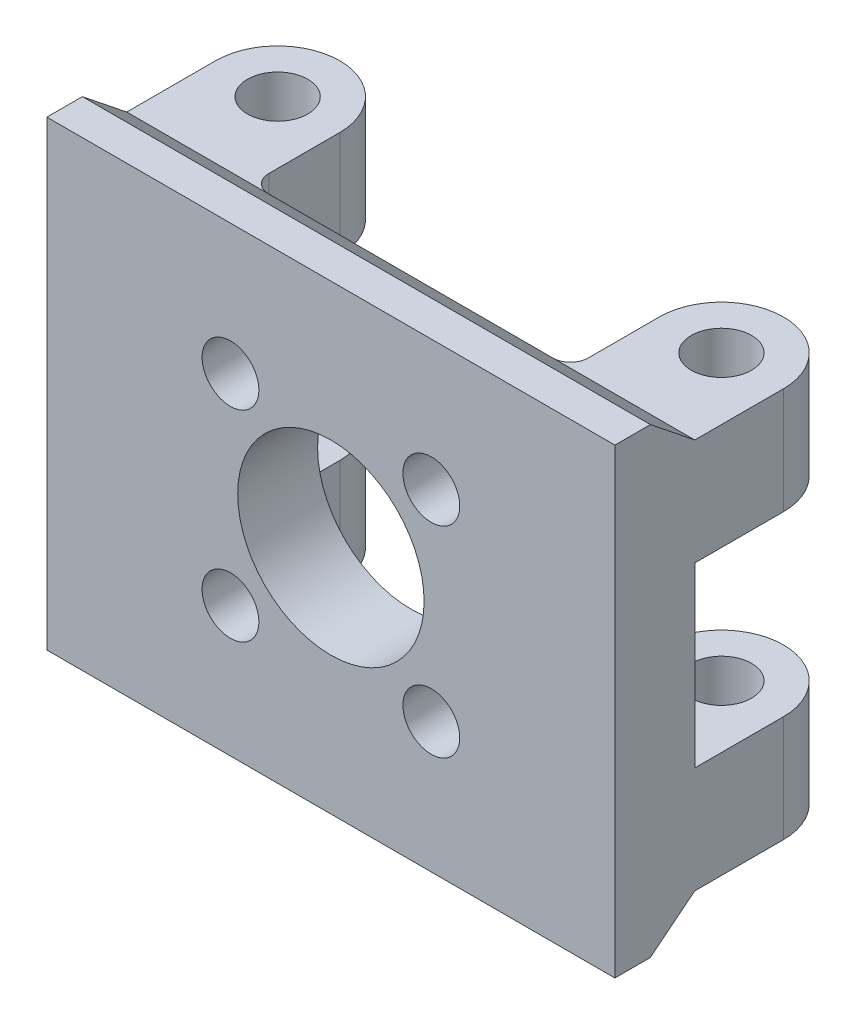
ISO-10303-21;
HEADER;
FILE_DESCRIPTION(('STEP AP214'),'2;1');
FILE_NAME('part.step','',(''),(''),'','','');
FILE_SCHEMA(('AUTOMOTIVE_DESIGN { 1 0 10303 214 1 1 1 1 }'));
ENDSEC;
DATA;
#1=APPLICATION_CONTEXT('core data for automotive mechanical design processes');
#2=APPLICATION_PROTOCOL_DEFINITION('international standard','automotive_design',2000,#1);
#3=PRODUCT_CONTEXT('',#1,'mechanical');
#4=PRODUCT('Part','Part','',(#3));
#5=PRODUCT_RELATED_PRODUCT_CATEGORY('part','',(#4));
#6=PRODUCT_DEFINITION_FORMATION('','',#4);
#7=PRODUCT_DEFINITION_CONTEXT('part definition',#1,'design');
#8=PRODUCT_DEFINITION('design','',#6,#7);
#9=PRODUCT_DEFINITION_SHAPE('','',#8);
#10=(LENGTH_UNIT() NAMED_UNIT(*) SI_UNIT(.MILLI.,.METRE.));
#11=(NAMED_UNIT(*) PLANE_ANGLE_UNIT() SI_UNIT($,.RADIAN.));
#12=(NAMED_UNIT(*) SI_UNIT($,.STERADIAN.) SOLID_ANGLE_UNIT());
#13=UNCERTAINTY_MEASURE_WITH_UNIT(LENGTH_MEASURE(1.E-05),#10,'distance_accuracy_value','');
#14=(GEOMETRIC_REPRESENTATION_CONTEXT(3) GLOBAL_UNCERTAINTY_ASSIGNED_CONTEXT((#13)) GLOBAL_UNIT_ASSIGNED_CONTEXT((#10,
#11,#12)) REPRESENTATION_CONTEXT('',''));
#15=CARTESIAN_POINT('',(0.,0.,0.));
#16=DIRECTION('',(0.,0.,1.));
#17=DIRECTION('',(1.,0.,0.));
#18=AXIS2_PLACEMENT_3D('',#15,#16,#17);
#19=CARTESIAN_POINT('',(-16.,11.,2.5));
#20=DIRECTION('',(0.,1.,0.));
#21=DIRECTION('',(-1.,0.,0.));
#22=AXIS2_PLACEMENT_3D('',#19,#20,#21);
#23=PLANE('',#22);
#24=DIRECTION('',(1.,0.,0.));
#25=VECTOR('',#24,1.);
#26=CARTESIAN_POINT('',(-16.,11.,0.));
#27=LINE('',#26,#25);
#28=CARTESIAN_POINT('',(16.,11.,0.));
#29=VERTEX_POINT('',#28);
#30=CARTESIAN_POINT('',(8.00000000000001,11.,0.));
#31=VERTEX_POINT('',#30);
#32=EDGE_CURVE('E208',#29,#31,#27,.F.);
#33=ORIENTED_EDGE('',*,*,#32,.F.);
#34=DIRECTION('',(0.,0.,-1.));
#35=VECTOR('',#34,1.);
#36=CARTESIAN_POINT('',(16.,11.,2.5));
#37=LINE('',#36,#35);
#38=CARTESIAN_POINT('',(16.,11.,-5.));
#39=VERTEX_POINT('',#38);
#40=EDGE_CURVE('E224',#29,#39,#37,.T.);
#41=ORIENTED_EDGE('',*,*,#40,.T.);
#42=CARTESIAN_POINT('',(12.5,11.,-5.));
#43=DIRECTION('',(0.,1.,0.));
#44=DIRECTION('',(0.,0.,1.));
#45=AXIS2_PLACEMENT_3D('',#42,#43,#44);
#46=CIRCLE('',#45,3.5);
#47=CARTESIAN_POINT('',(9.00000000000001,11.,-5.));
#48=VERTEX_POINT('',#47);
#49=EDGE_CURVE('E328',#39,#48,#46,.T.);
#50=ORIENTED_EDGE('',*,*,#49,.T.);
#51=DIRECTION('',(0.,0.,1.));
#52=VECTOR('',#51,1.);
#53=CARTESIAN_POINT('',(9.00000000000001,11.,-5.));
#54=LINE('',#53,#52);
#55=CARTESIAN_POINT('',(9.00000000000001,11.,-1.));
#56=VERTEX_POINT('',#55);
#57=EDGE_CURVE('E351',#48,#56,#54,.T.);
#58=ORIENTED_EDGE('',*,*,#57,.T.);
#59=CARTESIAN_POINT('',(8.,11.,-1.));
#60=DIRECTION('',(0.,-1.,0.));
#61=DIRECTION('',(0.,0.,-1.));
#62=AXIS2_PLACEMENT_3D('',#59,#60,#61);
#63=CIRCLE('',#62,1.);
#64=EDGE_CURVE('E337',#56,#31,#63,.T.);
#65=ORIENTED_EDGE('',*,*,#64,.T.);
#66=EDGE_LOOP('',(#33,#41,#50,#58,#65));
#67=FACE_BOUND('',#66,.T.);
#68=CARTESIAN_POINT('',(12.5,11.,-5.));
#69=DIRECTION('',(0.,1.,0.));
#70=DIRECTION('',(0.,0.,1.));
#71=AXIS2_PLACEMENT_3D('',#68,#69,#70);
#72=CIRCLE('',#71,1.69999999999999);
#73=CARTESIAN_POINT('',(12.5,11.,-3.30000000000001));
#74=VERTEX_POINT('',#73);
#75=EDGE_CURVE('E485',#74,#74,#72,.T.);
#76=ORIENTED_EDGE('',*,*,#75,.F.);
#77=EDGE_LOOP('',(#76));
#78=FACE_BOUND('',#77,.T.);
#79=ADVANCED_FACE('F36',(#67,#78),#23,.T.);
#80=CARTESIAN_POINT('',(16.,-11.,2.5));
#81=DIRECTION('',(0.,-1.,0.));
#82=DIRECTION('',(0.,0.,-1.));
#83=AXIS2_PLACEMENT_3D('',#80,#81,#82);
#84=PLANE('',#83);
#85=DIRECTION('',(-1.,0.,0.));
#86=VECTOR('',#85,1.);
#87=CARTESIAN_POINT('',(16.,-11.,0.));
#88=LINE('',#87,#86);
#89=CARTESIAN_POINT('',(-16.,-11.,0.));
#90=VERTEX_POINT('',#89);
#91=CARTESIAN_POINT('',(-8.,-11.,0.));
#92=VERTEX_POINT('',#91);
#93=EDGE_CURVE('E528',#90,#92,#88,.F.);
#94=ORIENTED_EDGE('',*,*,#93,.F.);
#95=DIRECTION('',(0.,0.,-1.));
#96=VECTOR('',#95,1.);
#97=CARTESIAN_POINT('',(-16.,-11.,2.5));
#98=LINE('',#97,#96);
#99=CARTESIAN_POINT('',(-16.,-11.,-5.));
#100=VERTEX_POINT('',#99);
#101=EDGE_CURVE('E11',#90,#100,#98,.T.);
#102=ORIENTED_EDGE('',*,*,#101,.T.);
#103=CARTESIAN_POINT('',(-12.5,-11.,-5.));
#104=DIRECTION('',(0.,-1.,0.));
#105=DIRECTION('',(0.,0.,-1.));
#106=AXIS2_PLACEMENT_3D('',#103,#104,#105);
#107=CIRCLE('',#106,3.5);
#108=CARTESIAN_POINT('',(-9.00000000000001,-11.,-5.));
#109=VERTEX_POINT('',#108);
#110=EDGE_CURVE('E295',#100,#109,#107,.T.);
#111=ORIENTED_EDGE('',*,*,#110,.T.);
#112=DIRECTION('',(0.,0.,1.));
#113=VECTOR('',#112,1.);
#114=CARTESIAN_POINT('',(-9.00000000000001,-11.,-5.));
#115=LINE('',#114,#113);
#116=CARTESIAN_POINT('',(-9.00000000000001,-11.,-1.));
#117=VERTEX_POINT('',#116);
#118=EDGE_CURVE('E282',#109,#117,#115,.T.);
#119=ORIENTED_EDGE('',*,*,#118,.T.);
#120=CARTESIAN_POINT('',(-8.,-11.,-1.));
#121=DIRECTION('',(0.,1.,0.));
#122=DIRECTION('',(0.,0.,1.));
#123=AXIS2_PLACEMENT_3D('',#120,#121,#122);
#124=CIRCLE('',#123,1.);
#125=EDGE_CURVE('E272',#117,#92,#124,.T.);
#126=ORIENTED_EDGE('',*,*,#125,.T.);
#127=EDGE_LOOP('',(#94,#102,#111,#119,#126));
#128=FACE_BOUND('',#127,.T.);
#129=CARTESIAN_POINT('',(-12.5,-11.,-5.));
#130=DIRECTION('',(0.,1.,0.));
#131=DIRECTION('',(0.,0.,1.));
#132=AXIS2_PLACEMENT_3D('',#129,#130,#131);
#133=CIRCLE('',#132,1.69999999999999);
#134=CARTESIAN_POINT('',(-12.5,-11.,-3.30000000000001));
#135=VERTEX_POINT('',#134);
#136=EDGE_CURVE('E258',#135,#135,#133,.T.);
#137=ORIENTED_EDGE('',*,*,#136,.T.);
#138=EDGE_LOOP('',(#137));
#139=FACE_BOUND('',#138,.T.);
#140=ADVANCED_FACE('F418',(#128,#139),#84,.T.);
#141=CARTESIAN_POINT('',(-8.,11.,0.));
#142=VERTEX_POINT('',#141);
#143=CARTESIAN_POINT('',(-16.,11.,0.));
#144=VERTEX_POINT('',#143);
#145=EDGE_CURVE('E197',#142,#144,#27,.F.);
#146=ORIENTED_EDGE('',*,*,#145,.F.);
#147=CARTESIAN_POINT('',(-8.,11.,-1.));
#148=DIRECTION('',(0.,-1.,0.));
#149=DIRECTION('',(0.,0.,-1.));
#150=AXIS2_PLACEMENT_3D('',#147,#148,#149);
#151=CIRCLE('',#150,1.);
#152=CARTESIAN_POINT('',(-9.00000000000001,11.,-1.));
#153=VERTEX_POINT('',#152);
#154=EDGE_CURVE('E302',#142,#153,#151,.T.);
#155=ORIENTED_EDGE('',*,*,#154,.T.);
#156=DIRECTION('',(0.,0.,-1.));
#157=VECTOR('',#156,1.);
#158=CARTESIAN_POINT('',(-9.00000000000001,11.,-1.));
#159=LINE('',#158,#157);
#160=CARTESIAN_POINT('',(-9.00000000000001,11.,-5.));
#161=VERTEX_POINT('',#160);
#162=EDGE_CURVE('E323',#153,#161,#159,.T.);
#163=ORIENTED_EDGE('',*,*,#162,.T.);
#164=CARTESIAN_POINT('',(-12.5,11.,-5.));
#165=DIRECTION('',(0.,1.,0.));
#166=DIRECTION('',(0.,0.,1.));
#167=AXIS2_PLACEMENT_3D('',#164,#165,#166);
#168=CIRCLE('',#167,3.5);
#169=CARTESIAN_POINT('',(-16.,11.,-5.));
#170=VERTEX_POINT('',#169);
#171=EDGE_CURVE('E223',#161,#170,#168,.T.);
#172=ORIENTED_EDGE('',*,*,#171,.T.);
#173=DIRECTION('',(0.,0.,-1.));
#174=VECTOR('',#173,1.);
#175=CARTESIAN_POINT('',(-16.,11.,2.5));
#176=LINE('',#175,#174);
#177=EDGE_CURVE('E40',#144,#170,#176,.T.);
#178=ORIENTED_EDGE('',*,*,#177,.F.);
#179=EDGE_LOOP('',(#146,#155,#163,#172,#178));
#180=FACE_BOUND('',#179,.T.);
#181=CARTESIAN_POINT('',(-12.5,11.,-5.));
#182=DIRECTION('',(0.,-1.,0.));
#183=DIRECTION('',(0.,0.,-1.));
#184=AXIS2_PLACEMENT_3D('',#181,#182,#183);
#185=CIRCLE('',#184,1.69999999999999);
#186=CARTESIAN_POINT('',(-12.5,11.,-6.69999999999999));
#187=VERTEX_POINT('',#186);
#188=EDGE_CURVE('E494',#187,#187,#185,.T.);
#189=ORIENTED_EDGE('',*,*,#188,.T.);
#190=EDGE_LOOP('',(#189));
#191=FACE_BOUND('',#190,.T.);
#192=ADVANCED_FACE('F219',(#180,#191),#23,.T.);
#193=CARTESIAN_POINT('',(0.,0.,0.));
#194=DIRECTION('',(0.,0.,-1.));
#195=DIRECTION('',(-1.,0.,0.));
#196=AXIS2_PLACEMENT_3D('',#193,#194,#195);
#197=PLANE('',#196);
#198=CARTESIAN_POINT('',(0.,0.,0.));
#199=DIRECTION('',(0.,0.,-1.));
#200=DIRECTION('',(-1.,0.,0.));
#201=AXIS2_PLACEMENT_3D('',#198,#199,#200);
#202=CIRCLE('',#201,5.24999999999999);
#203=CARTESIAN_POINT('',(-5.24999999999999,0.,0.));
#204=VERTEX_POINT('',#203);
#205=EDGE_CURVE('E470',#204,#204,#202,.T.);
#206=ORIENTED_EDGE('',*,*,#205,.F.);
#207=EDGE_LOOP('',(#206));
#208=FACE_BOUND('',#207,.T.);
#209=CARTESIAN_POINT('',(-5.65685424949239,5.65685424949237,0.));
#210=DIRECTION('',(0.,0.,-1.));
#211=DIRECTION('',(-1.,0.,0.));
#212=AXIS2_PLACEMENT_3D('',#209,#210,#211);
#213=CIRCLE('',#212,1.59999999999999);
#214=CARTESIAN_POINT('',(-7.25685424949238,5.65685424949237,0.));
#215=VERTEX_POINT('',#214);
#216=EDGE_CURVE('E473',#215,#215,#213,.T.);
#217=ORIENTED_EDGE('',*,*,#216,.F.);
#218=EDGE_LOOP('',(#217));
#219=FACE_BOUND('',#218,.T.);
#220=CARTESIAN_POINT('',(5.65685424949237,5.65685424949272,0.));
#221=DIRECTION('',(0.,0.,-1.));
#222=DIRECTION('',(-1.,0.,0.));
#223=AXIS2_PLACEMENT_3D('',#220,#221,#222);
#224=CIRCLE('',#223,1.59999999999999);
#225=CARTESIAN_POINT('',(4.05685424949238,5.65685424949272,0.));
#226=VERTEX_POINT('',#225);
#227=EDGE_CURVE('E476',#226,#226,#224,.T.);
#228=ORIENTED_EDGE('',*,*,#227,.F.);
#229=EDGE_LOOP('',(#228));
#230=FACE_BOUND('',#229,.T.);
#231=CARTESIAN_POINT('',(5.65685424949272,-5.65685424949204,0.));
#232=DIRECTION('',(0.,0.,-1.));
#233=DIRECTION('',(-1.,0.,0.));
#234=AXIS2_PLACEMENT_3D('',#231,#232,#233);
#235=CIRCLE('',#234,1.59999999999999);
#236=CARTESIAN_POINT('',(4.05685424949273,-5.65685424949204,0.));
#237=VERTEX_POINT('',#236);
#238=EDGE_CURVE('E479',#237,#237,#235,.T.);
#239=ORIENTED_EDGE('',*,*,#238,.F.);
#240=EDGE_LOOP('',(#239));
#241=FACE_BOUND('',#240,.T.);
#242=CARTESIAN_POINT('',(-5.65685424949204,-5.65685424949239,0.));
#243=DIRECTION('',(0.,0.,-1.));
#244=DIRECTION('',(-1.,0.,0.));
#245=AXIS2_PLACEMENT_3D('',#242,#243,#244);
#246=CIRCLE('',#245,1.59999999999999);
#247=CARTESIAN_POINT('',(-7.25685424949203,-5.65685424949239,0.));
#248=VERTEX_POINT('',#247);
#249=EDGE_CURVE('E482',#248,#248,#246,.T.);
#250=ORIENTED_EDGE('',*,*,#249,.F.);
#251=EDGE_LOOP('',(#250));
#252=FACE_BOUND('',#251,.T.);
#253=DIRECTION('',(0.,-1.,0.));
#254=VECTOR('',#253,1.);
#255=CARTESIAN_POINT('',(8.,-5.,0.));
#256=LINE('',#255,#254);
#257=CARTESIAN_POINT('',(8.,-5.,0.));
#258=VERTEX_POINT('',#257);
#259=CARTESIAN_POINT('',(8.,-11.,0.));
#260=VERTEX_POINT('',#259);
#261=EDGE_CURVE('E275',#258,#260,#256,.T.);
#262=ORIENTED_EDGE('',*,*,#261,.T.);
#263=DIRECTION('',(-1.,0.,0.));
#264=VECTOR('',#263,1.);
#265=CARTESIAN_POINT('',(16.,-11.,0.));
#266=LINE('',#265,#264);
#267=EDGE_CURVE('E225',#260,#92,#266,.T.);
#268=ORIENTED_EDGE('',*,*,#267,.T.);
#269=DIRECTION('',(0.,-1.,0.));
#270=VECTOR('',#269,1.);
#271=CARTESIAN_POINT('',(-8.00000000000001,-5.,0.));
#272=LINE('',#271,#270);
#273=CARTESIAN_POINT('',(-8.00000000000001,-5.,0.));
#274=VERTEX_POINT('',#273);
#275=EDGE_CURVE('E292',#274,#92,#272,.T.);
#276=ORIENTED_EDGE('',*,*,#275,.F.);
#277=DIRECTION('',(-1.,0.,0.));
#278=VECTOR('',#277,1.);
#279=CARTESIAN_POINT('',(-8.00000000000001,-5.,0.));
#280=LINE('',#279,#278);
#281=CARTESIAN_POINT('',(-16.,-5.,0.));
#282=VERTEX_POINT('',#281);
#283=EDGE_CURVE('E281',#274,#282,#280,.T.);
#284=ORIENTED_EDGE('',*,*,#283,.T.);
#285=DIRECTION('',(0.,1.,0.));
#286=VECTOR('',#285,1.);
#287=CARTESIAN_POINT('',(-16.,-11.,0.));
#288=LINE('',#287,#286);
#289=CARTESIAN_POINT('',(-16.,5.,0.));
#290=VERTEX_POINT('',#289);
#291=EDGE_CURVE('E358',#282,#290,#288,.T.);
#292=ORIENTED_EDGE('',*,*,#291,.T.);
#293=DIRECTION('',(1.,0.,0.));
#294=VECTOR('',#293,1.);
#295=CARTESIAN_POINT('',(-16.,5.,0.));
#296=LINE('',#295,#294);
#297=CARTESIAN_POINT('',(-8.,5.,0.));
#298=VERTEX_POINT('',#297);
#299=EDGE_CURVE('E311',#290,#298,#296,.T.);
#300=ORIENTED_EDGE('',*,*,#299,.T.);
#301=DIRECTION('',(0.,1.,0.));
#302=VECTOR('',#301,1.);
#303=CARTESIAN_POINT('',(-8.,5.,0.));
#304=LINE('',#303,#302);
#305=EDGE_CURVE('E321',#298,#142,#304,.T.);
#306=ORIENTED_EDGE('',*,*,#305,.T.);
#307=DIRECTION('',(1.,0.,0.));
#308=VECTOR('',#307,1.);
#309=CARTESIAN_POINT('',(-16.,11.,0.));
#310=LINE('',#309,#308);
#311=EDGE_CURVE('E203',#142,#31,#310,.T.);
#312=ORIENTED_EDGE('',*,*,#311,.T.);
#313=DIRECTION('',(0.,1.,0.));
#314=VECTOR('',#313,1.);
#315=CARTESIAN_POINT('',(8.00000000000001,5.,0.));
#316=LINE('',#315,#314);
#317=CARTESIAN_POINT('',(8.00000000000001,5.,0.));
#318=VERTEX_POINT('',#317);
#319=EDGE_CURVE('E359',#318,#31,#316,.T.);
#320=ORIENTED_EDGE('',*,*,#319,.F.);
#321=DIRECTION('',(1.,0.,0.));
#322=VECTOR('',#321,1.);
#323=CARTESIAN_POINT('',(8.00000000000001,5.,0.));
#324=LINE('',#323,#322);
#325=CARTESIAN_POINT('',(16.,5.,0.));
#326=VERTEX_POINT('',#325);
#327=EDGE_CURVE('E343',#318,#326,#324,.T.);
#328=ORIENTED_EDGE('',*,*,#327,.T.);
#329=DIRECTION('',(0.,-1.,0.));
#330=VECTOR('',#329,1.);
#331=CARTESIAN_POINT('',(16.,11.,0.));
#332=LINE('',#331,#330);
#333=CARTESIAN_POINT('',(16.,-5.,0.));
#334=VERTEX_POINT('',#333);
#335=EDGE_CURVE('E58',#326,#334,#332,.T.);
#336=ORIENTED_EDGE('',*,*,#335,.T.);
#337=DIRECTION('',(-1.,0.,0.));
#338=VECTOR('',#337,1.);
#339=CARTESIAN_POINT('',(16.,-5.,0.));
#340=LINE('',#339,#338);
#341=EDGE_CURVE('E53',#334,#258,#340,.T.);
#342=ORIENTED_EDGE('',*,*,#341,.T.);
#343=EDGE_LOOP('',(#262,#268,#276,#284,#292,#300,#306,#312,#320,#328,#336,#342));
#344=FACE_BOUND('',#343,.T.);
#345=ADVANCED_FACE('F365',(#208,#219,#230,#241,#252,#344),#197,.T.);
#346=CARTESIAN_POINT('',(-16.,-11.,2.5));
#347=DIRECTION('',(-1.,0.,0.));
#348=DIRECTION('',(0.,0.,1.));
#349=AXIS2_PLACEMENT_3D('',#346,#347,#348);
#350=PLANE('',#349);
#351=DIRECTION('',(0.,-0.624695047554424,-0.780868809443031));
#352=VECTOR('',#351,1.);
#353=CARTESIAN_POINT('',(-16.,13.,2.5));
#354=LINE('',#353,#352);
#355=CARTESIAN_POINT('',(-16.,13.,2.5));
#356=VERTEX_POINT('',#355);
#357=EDGE_CURVE('E200',#356,#144,#354,.T.);
#358=ORIENTED_EDGE('',*,*,#357,.T.);
#359=ORIENTED_EDGE('',*,*,#177,.T.);
#360=DIRECTION('',(0.,1.,0.));
#361=VECTOR('',#360,1.);
#362=CARTESIAN_POINT('',(-16.,5.,-5.));
#363=LINE('',#362,#361);
#364=CARTESIAN_POINT('',(-16.,5.,-5.));
#365=VERTEX_POINT('',#364);
#366=EDGE_CURVE('E326',#365,#170,#363,.T.);
#367=ORIENTED_EDGE('',*,*,#366,.F.);
#368=DIRECTION('',(0.,0.,1.));
#369=VECTOR('',#368,1.);
#370=CARTESIAN_POINT('',(-16.,5.,-5.));
#371=LINE('',#370,#369);
#372=EDGE_CURVE('E308',#365,#290,#371,.T.);
#373=ORIENTED_EDGE('',*,*,#372,.T.);
#374=ORIENTED_EDGE('',*,*,#291,.F.);
#375=DIRECTION('',(0.,0.,-1.));
#376=VECTOR('',#375,1.);
#377=CARTESIAN_POINT('',(-16.,-5.,0.));
#378=LINE('',#377,#376);
#379=CARTESIAN_POINT('',(-16.,-5.,-5.));
#380=VERTEX_POINT('',#379);
#381=EDGE_CURVE('E284',#282,#380,#378,.T.);
#382=ORIENTED_EDGE('',*,*,#381,.T.);
#383=DIRECTION('',(0.,-1.,0.));
#384=VECTOR('',#383,1.);
#385=CARTESIAN_POINT('',(-16.,-5.,-5.));
#386=LINE('',#385,#384);
#387=EDGE_CURVE('E305',#380,#100,#386,.T.);
#388=ORIENTED_EDGE('',*,*,#387,.T.);
#389=ORIENTED_EDGE('',*,*,#101,.F.);
#390=DIRECTION('',(0.,0.624695047554425,-0.78086880944303));
#391=VECTOR('',#390,1.);
#392=CARTESIAN_POINT('',(-16.,-13.,2.5));
#393=LINE('',#392,#391);
#394=CARTESIAN_POINT('',(-16.,-13.,2.5));
#395=VERTEX_POINT('',#394);
#396=EDGE_CURVE('E529',#395,#90,#393,.T.);
#397=ORIENTED_EDGE('',*,*,#396,.F.);
#398=DIRECTION('',(0.,0.,-1.));
#399=VECTOR('',#398,1.);
#400=CARTESIAN_POINT('',(-16.,-13.,4.5));
#401=LINE('',#400,#399);
#402=CARTESIAN_POINT('',(-16.,-13.,4.5));
#403=VERTEX_POINT('',#402);
#404=EDGE_CURVE('E463',#403,#395,#401,.T.);
#405=ORIENTED_EDGE('',*,*,#404,.F.);
#406=DIRECTION('',(0.,-1.,0.));
#407=VECTOR('',#406,1.);
#408=CARTESIAN_POINT('',(-16.,11.,4.5));
#409=LINE('',#408,#407);
#410=CARTESIAN_POINT('',(-16.,13.,4.5));
#411=VERTEX_POINT('',#410);
#412=EDGE_CURVE('E550',#411,#403,#409,.T.);
#413=ORIENTED_EDGE('',*,*,#412,.F.);
#414=DIRECTION('',(0.,0.,-1.));
#415=VECTOR('',#414,1.);
#416=CARTESIAN_POINT('',(-16.,13.,4.5));
#417=LINE('',#416,#415);
#418=EDGE_CURVE('E217',#411,#356,#417,.T.);
#419=ORIENTED_EDGE('',*,*,#418,.T.);
#420=EDGE_LOOP('',(#358,#359,#367,#373,#374,#382,#388,#389,#397,#405,#413,#419));
#421=FACE_BOUND('',#420,.T.);
#422=ADVANCED_FACE('F38',(#421),#350,.T.);
#423=CARTESIAN_POINT('',(16.,-11.,0.));
#424=VERTEX_POINT('',#423);
#425=EDGE_CURVE('E526',#260,#424,#88,.F.);
#426=ORIENTED_EDGE('',*,*,#425,.F.);
#427=CARTESIAN_POINT('',(8.,-11.,-1.));
#428=DIRECTION('',(0.,1.,0.));
#429=DIRECTION('',(0.,0.,1.));
#430=AXIS2_PLACEMENT_3D('',#427,#428,#429);
#431=CIRCLE('',#430,1.);
#432=CARTESIAN_POINT('',(9.00000000000001,-11.,-1.));
#433=VERTEX_POINT('',#432);
#434=EDGE_CURVE('E257',#260,#433,#431,.T.);
#435=ORIENTED_EDGE('',*,*,#434,.T.);
#436=DIRECTION('',(0.,0.,-1.));
#437=VECTOR('',#436,1.);
#438=CARTESIAN_POINT('',(9.00000000000001,-11.,-1.));
#439=LINE('',#438,#437);
#440=CARTESIAN_POINT('',(9.00000000000001,-11.,-5.));
#441=VERTEX_POINT('',#440);
#442=EDGE_CURVE('E255',#433,#441,#439,.T.);
#443=ORIENTED_EDGE('',*,*,#442,.T.);
#444=CARTESIAN_POINT('',(12.5,-11.,-5.));
#445=DIRECTION('',(0.,-1.,0.));
#446=DIRECTION('',(0.,0.,-1.));
#447=AXIS2_PLACEMENT_3D('',#444,#445,#446);
#448=CIRCLE('',#447,3.5);
#449=CARTESIAN_POINT('',(16.,-11.,-5.));
#450=VERTEX_POINT('',#449);
#451=EDGE_CURVE('E250',#441,#450,#448,.T.);
#452=ORIENTED_EDGE('',*,*,#451,.T.);
#453=DIRECTION('',(0.,0.,-1.));
#454=VECTOR('',#453,1.);
#455=CARTESIAN_POINT('',(16.,-11.,2.5));
#456=LINE('',#455,#454);
#457=EDGE_CURVE('E45',#424,#450,#456,.T.);
#458=ORIENTED_EDGE('',*,*,#457,.F.);
#459=EDGE_LOOP('',(#426,#435,#443,#452,#458));
#460=FACE_BOUND('',#459,.T.);
#461=CARTESIAN_POINT('',(12.5,-11.,-5.));
#462=DIRECTION('',(0.,-1.,0.));
#463=DIRECTION('',(0.,0.,-1.));
#464=AXIS2_PLACEMENT_3D('',#461,#462,#463);
#465=CIRCLE('',#464,1.69999999999999);
#466=CARTESIAN_POINT('',(12.5,-11.,-6.69999999999999));
#467=VERTEX_POINT('',#466);
#468=EDGE_CURVE('E497',#467,#467,#465,.T.);
#469=ORIENTED_EDGE('',*,*,#468,.F.);
#470=EDGE_LOOP('',(#469));
#471=FACE_BOUND('',#470,.T.);
#472=ADVANCED_FACE('F251',(#460,#471),#84,.T.);
#473=CARTESIAN_POINT('',(16.,11.,2.5));
#474=DIRECTION('',(1.,0.,0.));
#475=DIRECTION('',(0.,1.,0.));
#476=AXIS2_PLACEMENT_3D('',#473,#474,#475);
#477=PLANE('',#476);
#478=ORIENTED_EDGE('',*,*,#40,.F.);
#479=DIRECTION('',(0.,-0.624695047554424,-0.780868809443031));
#480=VECTOR('',#479,1.);
#481=CARTESIAN_POINT('',(16.,13.,2.5));
#482=LINE('',#481,#480);
#483=CARTESIAN_POINT('',(16.,13.,2.5));
#484=VERTEX_POINT('',#483);
#485=EDGE_CURVE('E209',#484,#29,#482,.T.);
#486=ORIENTED_EDGE('',*,*,#485,.F.);
#487=DIRECTION('',(0.,0.,-1.));
#488=VECTOR('',#487,1.);
#489=CARTESIAN_POINT('',(16.,13.,4.5));
#490=LINE('',#489,#488);
#491=CARTESIAN_POINT('',(16.,13.,4.5));
#492=VERTEX_POINT('',#491);
#493=EDGE_CURVE('E453',#492,#484,#490,.T.);
#494=ORIENTED_EDGE('',*,*,#493,.F.);
#495=DIRECTION('',(0.,1.,0.));
#496=VECTOR('',#495,1.);
#497=CARTESIAN_POINT('',(16.,-11.,4.5));
#498=LINE('',#497,#496);
#499=CARTESIAN_POINT('',(16.,-13.,4.5));
#500=VERTEX_POINT('',#499);
#501=EDGE_CURVE('E554',#500,#492,#498,.T.);
#502=ORIENTED_EDGE('',*,*,#501,.F.);
#503=DIRECTION('',(0.,0.,-1.));
#504=VECTOR('',#503,1.);
#505=CARTESIAN_POINT('',(16.,-13.,4.5));
#506=LINE('',#505,#504);
#507=CARTESIAN_POINT('',(16.,-13.,2.5));
#508=VERTEX_POINT('',#507);
#509=EDGE_CURVE('E461',#500,#508,#506,.T.);
#510=ORIENTED_EDGE('',*,*,#509,.T.);
#511=DIRECTION('',(0.,0.624695047554425,-0.78086880944303));
#512=VECTOR('',#511,1.);
#513=CARTESIAN_POINT('',(16.,-13.,2.5));
#514=LINE('',#513,#512);
#515=EDGE_CURVE('E245',#508,#424,#514,.T.);
#516=ORIENTED_EDGE('',*,*,#515,.T.);
#517=ORIENTED_EDGE('',*,*,#457,.T.);
#518=DIRECTION('',(0.,-1.,0.));
#519=VECTOR('',#518,1.);
#520=CARTESIAN_POINT('',(16.,-5.,-5.));
#521=LINE('',#520,#519);
#522=CARTESIAN_POINT('',(16.,-5.,-5.));
#523=VERTEX_POINT('',#522);
#524=EDGE_CURVE('E242',#523,#450,#521,.T.);
#525=ORIENTED_EDGE('',*,*,#524,.F.);
#526=DIRECTION('',(0.,0.,1.));
#527=VECTOR('',#526,1.);
#528=CARTESIAN_POINT('',(16.,-5.,-5.));
#529=LINE('',#528,#527);
#530=EDGE_CURVE('E387',#523,#334,#529,.T.);
#531=ORIENTED_EDGE('',*,*,#530,.T.);
#532=ORIENTED_EDGE('',*,*,#335,.F.);
#533=DIRECTION('',(0.,0.,-1.));
#534=VECTOR('',#533,1.);
#535=CARTESIAN_POINT('',(16.,5.,0.));
#536=LINE('',#535,#534);
#537=CARTESIAN_POINT('',(16.,5.,-5.));
#538=VERTEX_POINT('',#537);
#539=EDGE_CURVE('E345',#326,#538,#536,.T.);
#540=ORIENTED_EDGE('',*,*,#539,.T.);
#541=DIRECTION('',(0.,1.,0.));
#542=VECTOR('',#541,1.);
#543=CARTESIAN_POINT('',(16.,5.,-5.));
#544=LINE('',#543,#542);
#545=EDGE_CURVE('E356',#538,#39,#544,.T.);
#546=ORIENTED_EDGE('',*,*,#545,.T.);
#547=EDGE_LOOP('',(#478,#486,#494,#502,#510,#516,#517,#525,#531,#532,#540,#546));
#548=FACE_BOUND('',#547,.T.);
#549=ADVANCED_FACE('F240',(#548),#477,.T.);
#550=CARTESIAN_POINT('',(12.5,5.,-5.));
#551=DIRECTION('',(0.,1.,0.));
#552=DIRECTION('',(0.,0.,1.));
#553=AXIS2_PLACEMENT_3D('',#550,#551,#552);
#554=CYLINDRICAL_SURFACE('',#553,3.5);
#555=CARTESIAN_POINT('',(12.5,5.,-5.));
#556=DIRECTION('',(0.,1.,0.));
#557=DIRECTION('',(0.,0.,1.));
#558=AXIS2_PLACEMENT_3D('',#555,#556,#557);
#559=CIRCLE('',#558,3.5);
#560=CARTESIAN_POINT('',(9.00000000000001,5.,-5.));
#561=VERTEX_POINT('',#560);
#562=EDGE_CURVE('E334',#538,#561,#559,.T.);
#563=ORIENTED_EDGE('',*,*,#562,.T.);
#564=DIRECTION('',(0.,1.,0.));
#565=VECTOR('',#564,1.);
#566=CARTESIAN_POINT('',(9.00000000000001,5.,-5.));
#567=LINE('',#566,#565);
#568=EDGE_CURVE('E348',#561,#48,#567,.T.);
#569=ORIENTED_EDGE('',*,*,#568,.T.);
#570=ORIENTED_EDGE('',*,*,#49,.F.);
#571=ORIENTED_EDGE('',*,*,#545,.F.);
#572=EDGE_LOOP('',(#563,#569,#570,#571));
#573=FACE_BOUND('',#572,.T.);
#574=ADVANCED_FACE('F437',(#573),#554,.T.);
#575=CARTESIAN_POINT('',(8.,5.,-1.));
#576=DIRECTION('',(0.,1.,0.));
#577=DIRECTION('',(0.,0.,1.));
#578=AXIS2_PLACEMENT_3D('',#575,#576,#577);
#579=CYLINDRICAL_SURFACE('',#578,1.);
#580=ORIENTED_EDGE('',*,*,#64,.F.);
#581=DIRECTION('',(0.,1.,0.));
#582=VECTOR('',#581,1.);
#583=CARTESIAN_POINT('',(9.00000000000001,5.,-1.));
#584=LINE('',#583,#582);
#585=CARTESIAN_POINT('',(9.00000000000001,5.,-1.));
#586=VERTEX_POINT('',#585);
#587=EDGE_CURVE('E362',#586,#56,#584,.T.);
#588=ORIENTED_EDGE('',*,*,#587,.F.);
#589=CARTESIAN_POINT('',(8.,5.,-1.));
#590=DIRECTION('',(0.,-1.,0.));
#591=DIRECTION('',(0.,0.,-1.));
#592=AXIS2_PLACEMENT_3D('',#589,#590,#591);
#593=CIRCLE('',#592,1.);
#594=EDGE_CURVE('E340',#586,#318,#593,.T.);
#595=ORIENTED_EDGE('',*,*,#594,.T.);
#596=ORIENTED_EDGE('',*,*,#319,.T.);
#597=EDGE_LOOP('',(#580,#588,#595,#596));
#598=FACE_BOUND('',#597,.T.);
#599=ADVANCED_FACE('F371',(#598),#579,.F.);
#600=CARTESIAN_POINT('',(9.00000000000001,5.,-5.));
#601=DIRECTION('',(-1.,0.,0.));
#602=DIRECTION('',(0.,0.,1.));
#603=AXIS2_PLACEMENT_3D('',#600,#601,#602);
#604=PLANE('',#603);
#605=ORIENTED_EDGE('',*,*,#57,.F.);
#606=ORIENTED_EDGE('',*,*,#568,.F.);
#607=DIRECTION('',(0.,0.,1.));
#608=VECTOR('',#607,1.);
#609=CARTESIAN_POINT('',(9.00000000000001,5.,-5.));
#610=LINE('',#609,#608);
#611=EDGE_CURVE('E336',#561,#586,#610,.T.);
#612=ORIENTED_EDGE('',*,*,#611,.T.);
#613=ORIENTED_EDGE('',*,*,#587,.T.);
#614=EDGE_LOOP('',(#605,#606,#612,#613));
#615=FACE_BOUND('',#614,.T.);
#616=ADVANCED_FACE('F380',(#615),#604,.T.);
#617=CARTESIAN_POINT('',(12.5,5.,-5.));
#618=DIRECTION('',(0.,1.,0.));
#619=DIRECTION('',(0.,0.,1.));
#620=AXIS2_PLACEMENT_3D('',#617,#618,#619);
#621=PLANE('',#620);
#622=ORIENTED_EDGE('',*,*,#611,.F.);
#623=ORIENTED_EDGE('',*,*,#562,.F.);
#624=ORIENTED_EDGE('',*,*,#539,.F.);
#625=ORIENTED_EDGE('',*,*,#327,.F.);
#626=ORIENTED_EDGE('',*,*,#594,.F.);
#627=EDGE_LOOP('',(#622,#623,#624,#625,#626));
#628=FACE_BOUND('',#627,.T.);
#629=CARTESIAN_POINT('',(12.5,5.,-5.));
#630=DIRECTION('',(0.,1.,0.));
#631=DIRECTION('',(0.,0.,1.));
#632=AXIS2_PLACEMENT_3D('',#629,#630,#631);
#633=CIRCLE('',#632,1.69999999999999);
#634=CARTESIAN_POINT('',(12.5,5.,-3.30000000000001));
#635=VERTEX_POINT('',#634);
#636=EDGE_CURVE('E488',#635,#635,#633,.T.);
#637=ORIENTED_EDGE('',*,*,#636,.T.);
#638=EDGE_LOOP('',(#637));
#639=FACE_BOUND('',#638,.T.);
#640=ADVANCED_FACE('F383',(#628,#639),#621,.F.);
#641=CARTESIAN_POINT('',(-12.5,5.,-5.));
#642=DIRECTION('',(0.,1.,0.));
#643=DIRECTION('',(0.,0.,1.));
#644=AXIS2_PLACEMENT_3D('',#641,#642,#643);
#645=CYLINDRICAL_SURFACE('',#644,3.5);
#646=CARTESIAN_POINT('',(-12.5,5.,-5.));
#647=DIRECTION('',(0.,1.,0.));
#648=DIRECTION('',(0.,0.,1.));
#649=AXIS2_PLACEMENT_3D('',#646,#647,#648);
#650=CIRCLE('',#649,3.5);
#651=CARTESIAN_POINT('',(-9.00000000000001,5.,-5.));
#652=VERTEX_POINT('',#651);
#653=EDGE_CURVE('E319',#652,#365,#650,.T.);
#654=ORIENTED_EDGE('',*,*,#653,.T.);
#655=ORIENTED_EDGE('',*,*,#366,.T.);
#656=ORIENTED_EDGE('',*,*,#171,.F.);
#657=DIRECTION('',(0.,1.,0.));
#658=VECTOR('',#657,1.);
#659=CARTESIAN_POINT('',(-9.00000000000001,5.,-5.));
#660=LINE('',#659,#658);
#661=EDGE_CURVE('E329',#652,#161,#660,.T.);
#662=ORIENTED_EDGE('',*,*,#661,.F.);
#663=EDGE_LOOP('',(#654,#655,#656,#662));
#664=FACE_BOUND('',#663,.T.);
#665=ADVANCED_FACE('F595',(#664),#645,.T.);
#666=CARTESIAN_POINT('',(-9.00000000000001,5.,-1.));
#667=DIRECTION('',(1.,0.,0.));
#668=DIRECTION('',(0.,0.,-1.));
#669=AXIS2_PLACEMENT_3D('',#666,#667,#668);
#670=PLANE('',#669);
#671=ORIENTED_EDGE('',*,*,#162,.F.);
#672=DIRECTION('',(0.,1.,0.));
#673=VECTOR('',#672,1.);
#674=CARTESIAN_POINT('',(-9.00000000000001,5.,-1.));
#675=LINE('',#674,#673);
#676=CARTESIAN_POINT('',(-9.00000000000001,5.,-1.));
#677=VERTEX_POINT('',#676);
#678=EDGE_CURVE('E331',#677,#153,#675,.T.);
#679=ORIENTED_EDGE('',*,*,#678,.F.);
#680=DIRECTION('',(0.,0.,-1.));
#681=VECTOR('',#680,1.);
#682=CARTESIAN_POINT('',(-9.00000000000001,5.,-1.));
#683=LINE('',#682,#681);
#684=EDGE_CURVE('E316',#677,#652,#683,.T.);
#685=ORIENTED_EDGE('',*,*,#684,.T.);
#686=ORIENTED_EDGE('',*,*,#661,.T.);
#687=EDGE_LOOP('',(#671,#679,#685,#686));
#688=FACE_BOUND('',#687,.T.);
#689=ADVANCED_FACE('F596',(#688),#670,.T.);
#690=CARTESIAN_POINT('',(-8.,5.,-1.));
#691=DIRECTION('',(0.,1.,0.));
#692=DIRECTION('',(0.,0.,1.));
#693=AXIS2_PLACEMENT_3D('',#690,#691,#692);
#694=CYLINDRICAL_SURFACE('',#693,1.);
#695=ORIENTED_EDGE('',*,*,#154,.F.);
#696=ORIENTED_EDGE('',*,*,#305,.F.);
#697=CARTESIAN_POINT('',(-8.,5.,-1.));
#698=DIRECTION('',(0.,-1.,0.));
#699=DIRECTION('',(0.,0.,-1.));
#700=AXIS2_PLACEMENT_3D('',#697,#698,#699);
#701=CIRCLE('',#700,1.);
#702=EDGE_CURVE('E313',#298,#677,#701,.T.);
#703=ORIENTED_EDGE('',*,*,#702,.T.);
#704=ORIENTED_EDGE('',*,*,#678,.T.);
#705=EDGE_LOOP('',(#695,#696,#703,#704));
#706=FACE_BOUND('',#705,.T.);
#707=ADVANCED_FACE('F591',(#706),#694,.F.);
#708=CARTESIAN_POINT('',(-8.,5.,-1.));
#709=DIRECTION('',(0.,-1.,0.));
#710=DIRECTION('',(0.,0.,-1.));
#711=AXIS2_PLACEMENT_3D('',#708,#709,#710);
#712=PLANE('',#711);
#713=ORIENTED_EDGE('',*,*,#372,.F.);
#714=ORIENTED_EDGE('',*,*,#653,.F.);
#715=ORIENTED_EDGE('',*,*,#684,.F.);
#716=ORIENTED_EDGE('',*,*,#702,.F.);
#717=ORIENTED_EDGE('',*,*,#299,.F.);
#718=EDGE_LOOP('',(#713,#714,#715,#716,#717));
#719=FACE_BOUND('',#718,.T.);
#720=CARTESIAN_POINT('',(-12.5,5.,-5.));
#721=DIRECTION('',(0.,-1.,0.));
#722=DIRECTION('',(0.,0.,-1.));
#723=AXIS2_PLACEMENT_3D('',#720,#721,#722);
#724=CIRCLE('',#723,1.69999999999999);
#725=CARTESIAN_POINT('',(-12.5,5.,-6.69999999999999));
#726=VERTEX_POINT('',#725);
#727=EDGE_CURVE('E491',#726,#726,#724,.T.);
#728=ORIENTED_EDGE('',*,*,#727,.F.);
#729=EDGE_LOOP('',(#728));
#730=FACE_BOUND('',#729,.T.);
#731=ADVANCED_FACE('F586',(#719,#730),#712,.T.);
#732=CARTESIAN_POINT('',(-8.,-5.,-1.));
#733=DIRECTION('',(0.,-1.,0.));
#734=DIRECTION('',(0.,0.,-1.));
#735=AXIS2_PLACEMENT_3D('',#732,#733,#734);
#736=CYLINDRICAL_SURFACE('',#735,1.);
#737=ORIENTED_EDGE('',*,*,#125,.F.);
#738=DIRECTION('',(0.,-1.,0.));
#739=VECTOR('',#738,1.);
#740=CARTESIAN_POINT('',(-9.00000000000001,-5.,-1.));
#741=LINE('',#740,#739);
#742=CARTESIAN_POINT('',(-9.00000000000001,-5.,-1.));
#743=VERTEX_POINT('',#742);
#744=EDGE_CURVE('E300',#743,#117,#741,.T.);
#745=ORIENTED_EDGE('',*,*,#744,.F.);
#746=CARTESIAN_POINT('',(-8.,-5.,-1.));
#747=DIRECTION('',(0.,1.,0.));
#748=DIRECTION('',(0.,0.,1.));
#749=AXIS2_PLACEMENT_3D('',#746,#747,#748);
#750=CIRCLE('',#749,1.);
#751=EDGE_CURVE('E278',#743,#274,#750,.T.);
#752=ORIENTED_EDGE('',*,*,#751,.T.);
#753=ORIENTED_EDGE('',*,*,#275,.T.);
#754=EDGE_LOOP('',(#737,#745,#752,#753));
#755=FACE_BOUND('',#754,.T.);
#756=ADVANCED_FACE('F575',(#755),#736,.F.);
#757=CARTESIAN_POINT('',(-9.00000000000001,-5.,-5.));
#758=DIRECTION('',(1.,0.,0.));
#759=DIRECTION('',(0.,0.,-1.));
#760=AXIS2_PLACEMENT_3D('',#757,#758,#759);
#761=PLANE('',#760);
#762=ORIENTED_EDGE('',*,*,#118,.F.);
#763=DIRECTION('',(0.,-1.,0.));
#764=VECTOR('',#763,1.);
#765=CARTESIAN_POINT('',(-9.00000000000001,-5.,-5.));
#766=LINE('',#765,#764);
#767=CARTESIAN_POINT('',(-9.00000000000001,-5.,-5.));
#768=VERTEX_POINT('',#767);
#769=EDGE_CURVE('E303',#768,#109,#766,.T.);
#770=ORIENTED_EDGE('',*,*,#769,.F.);
#771=DIRECTION('',(0.,0.,1.));
#772=VECTOR('',#771,1.);
#773=CARTESIAN_POINT('',(-9.00000000000001,-5.,-5.));
#774=LINE('',#773,#772);
#775=EDGE_CURVE('E289',#768,#743,#774,.T.);
#776=ORIENTED_EDGE('',*,*,#775,.T.);
#777=ORIENTED_EDGE('',*,*,#744,.T.);
#778=EDGE_LOOP('',(#762,#770,#776,#777));
#779=FACE_BOUND('',#778,.T.);
#780=ADVANCED_FACE('F766',(#779),#761,.T.);
#781=CARTESIAN_POINT('',(-12.5,-5.,-5.));
#782=DIRECTION('',(0.,-1.,0.));
#783=DIRECTION('',(0.,0.,-1.));
#784=AXIS2_PLACEMENT_3D('',#781,#782,#783);
#785=CYLINDRICAL_SURFACE('',#784,3.5);
#786=CARTESIAN_POINT('',(-12.5,-5.,-5.));
#787=DIRECTION('',(0.,-1.,0.));
#788=DIRECTION('',(0.,0.,-1.));
#789=AXIS2_PLACEMENT_3D('',#786,#787,#788);
#790=CIRCLE('',#789,3.5);
#791=EDGE_CURVE('E287',#380,#768,#790,.T.);
#792=ORIENTED_EDGE('',*,*,#791,.T.);
#793=ORIENTED_EDGE('',*,*,#769,.T.);
#794=ORIENTED_EDGE('',*,*,#110,.F.);
#795=ORIENTED_EDGE('',*,*,#387,.F.);
#796=EDGE_LOOP('',(#792,#793,#794,#795));
#797=FACE_BOUND('',#796,.T.);
#798=ADVANCED_FACE('F413',(#797),#785,.T.);
#799=CARTESIAN_POINT('',(-8.,-5.,-1.));
#800=DIRECTION('',(0.,1.,0.));
#801=DIRECTION('',(0.,0.,1.));
#802=AXIS2_PLACEMENT_3D('',#799,#800,#801);
#803=PLANE('',#802);
#804=ORIENTED_EDGE('',*,*,#775,.F.);
#805=ORIENTED_EDGE('',*,*,#791,.F.);
#806=ORIENTED_EDGE('',*,*,#381,.F.);
#807=ORIENTED_EDGE('',*,*,#283,.F.);
#808=ORIENTED_EDGE('',*,*,#751,.F.);
#809=EDGE_LOOP('',(#804,#805,#806,#807,#808));
#810=FACE_BOUND('',#809,.T.);
#811=CARTESIAN_POINT('',(-12.5,-5.,-5.));
#812=DIRECTION('',(0.,1.,0.));
#813=DIRECTION('',(0.,0.,1.));
#814=AXIS2_PLACEMENT_3D('',#811,#812,#813);
#815=CIRCLE('',#814,1.69999999999999);
#816=CARTESIAN_POINT('',(-12.5,-5.,-3.30000000000001));
#817=VERTEX_POINT('',#816);
#818=EDGE_CURVE('E262',#817,#817,#815,.T.);
#819=ORIENTED_EDGE('',*,*,#818,.F.);
#820=EDGE_LOOP('',(#819));
#821=FACE_BOUND('',#820,.T.);
#822=ADVANCED_FACE('F405',(#810,#821),#803,.T.);
#823=CARTESIAN_POINT('',(12.5,-5.,-5.));
#824=DIRECTION('',(0.,-1.,0.));
#825=DIRECTION('',(0.,0.,-1.));
#826=AXIS2_PLACEMENT_3D('',#823,#824,#825);
#827=CYLINDRICAL_SURFACE('',#826,3.5);
#828=CARTESIAN_POINT('',(12.5,-5.,-5.));
#829=DIRECTION('',(0.,-1.,0.));
#830=DIRECTION('',(0.,0.,-1.));
#831=AXIS2_PLACEMENT_3D('',#828,#829,#830);
#832=CIRCLE('',#831,3.5);
#833=CARTESIAN_POINT('',(9.00000000000001,-5.,-5.));
#834=VERTEX_POINT('',#833);
#835=EDGE_CURVE('E269',#834,#523,#832,.T.);
#836=ORIENTED_EDGE('',*,*,#835,.T.);
#837=ORIENTED_EDGE('',*,*,#524,.T.);
#838=ORIENTED_EDGE('',*,*,#451,.F.);
#839=DIRECTION('',(0.,-1.,0.));
#840=VECTOR('',#839,1.);
#841=CARTESIAN_POINT('',(9.00000000000001,-5.,-5.));
#842=LINE('',#841,#840);
#843=EDGE_CURVE('E270',#834,#441,#842,.T.);
#844=ORIENTED_EDGE('',*,*,#843,.F.);
#845=EDGE_LOOP('',(#836,#837,#838,#844));
#846=FACE_BOUND('',#845,.T.);
#847=ADVANCED_FACE('F403',(#846),#827,.T.);
#848=CARTESIAN_POINT('',(9.00000000000001,-5.,-1.));
#849=DIRECTION('',(-1.,0.,0.));
#850=DIRECTION('',(0.,0.,1.));
#851=AXIS2_PLACEMENT_3D('',#848,#849,#850);
#852=PLANE('',#851);
#853=ORIENTED_EDGE('',*,*,#442,.F.);
#854=DIRECTION('',(0.,-1.,0.));
#855=VECTOR('',#854,1.);
#856=CARTESIAN_POINT('',(9.00000000000001,-5.,-1.));
#857=LINE('',#856,#855);
#858=CARTESIAN_POINT('',(9.00000000000001,-5.,-1.));
#859=VERTEX_POINT('',#858);
#860=EDGE_CURVE('E273',#859,#433,#857,.T.);
#861=ORIENTED_EDGE('',*,*,#860,.F.);
#862=DIRECTION('',(0.,0.,-1.));
#863=VECTOR('',#862,1.);
#864=CARTESIAN_POINT('',(9.00000000000001,-5.,-1.));
#865=LINE('',#864,#863);
#866=EDGE_CURVE('E265',#859,#834,#865,.T.);
#867=ORIENTED_EDGE('',*,*,#866,.T.);
#868=ORIENTED_EDGE('',*,*,#843,.T.);
#869=EDGE_LOOP('',(#853,#861,#867,#868));
#870=FACE_BOUND('',#869,.T.);
#871=ADVANCED_FACE('F400',(#870),#852,.T.);
#872=CARTESIAN_POINT('',(8.,-5.,-1.));
#873=DIRECTION('',(0.,-1.,0.));
#874=DIRECTION('',(0.,0.,-1.));
#875=AXIS2_PLACEMENT_3D('',#872,#873,#874);
#876=CYLINDRICAL_SURFACE('',#875,1.);
#877=ORIENTED_EDGE('',*,*,#434,.F.);
#878=ORIENTED_EDGE('',*,*,#261,.F.);
#879=CARTESIAN_POINT('',(8.,-5.,-1.));
#880=DIRECTION('',(0.,1.,0.));
#881=DIRECTION('',(0.,0.,1.));
#882=AXIS2_PLACEMENT_3D('',#879,#880,#881);
#883=CIRCLE('',#882,1.);
#884=EDGE_CURVE('E391',#258,#859,#883,.T.);
#885=ORIENTED_EDGE('',*,*,#884,.T.);
#886=ORIENTED_EDGE('',*,*,#860,.T.);
#887=EDGE_LOOP('',(#877,#878,#885,#886));
#888=FACE_BOUND('',#887,.T.);
#889=ADVANCED_FACE('F411',(#888),#876,.F.);
#890=CARTESIAN_POINT('',(12.5,-5.,-5.));
#891=DIRECTION('',(0.,-1.,0.));
#892=DIRECTION('',(0.,0.,-1.));
#893=AXIS2_PLACEMENT_3D('',#890,#891,#892);
#894=PLANE('',#893);
#895=ORIENTED_EDGE('',*,*,#530,.F.);
#896=ORIENTED_EDGE('',*,*,#835,.F.);
#897=ORIENTED_EDGE('',*,*,#866,.F.);
#898=ORIENTED_EDGE('',*,*,#884,.F.);
#899=ORIENTED_EDGE('',*,*,#341,.F.);
#900=EDGE_LOOP('',(#895,#896,#897,#898,#899));
#901=FACE_BOUND('',#900,.T.);
#902=CARTESIAN_POINT('',(12.5,-5.,-5.));
#903=DIRECTION('',(0.,-1.,0.));
#904=DIRECTION('',(0.,0.,-1.));
#905=AXIS2_PLACEMENT_3D('',#902,#903,#904);
#906=CIRCLE('',#905,1.69999999999999);
#907=CARTESIAN_POINT('',(12.5,-5.,-6.69999999999999));
#908=VERTEX_POINT('',#907);
#909=EDGE_CURVE('E500',#908,#908,#906,.T.);
#910=ORIENTED_EDGE('',*,*,#909,.T.);
#911=EDGE_LOOP('',(#910));
#912=FACE_BOUND('',#911,.T.);
#913=ADVANCED_FACE('F401',(#901,#912),#894,.F.);
#914=CARTESIAN_POINT('',(-12.5,-5.,-5.));
#915=DIRECTION('',(0.,1.,0.));
#916=DIRECTION('',(0.,0.,1.));
#917=AXIS2_PLACEMENT_3D('',#914,#915,#916);
#918=CYLINDRICAL_SURFACE('',#917,1.69999999999999);
#919=ORIENTED_EDGE('',*,*,#136,.F.);
#920=EDGE_LOOP('',(#919));
#921=FACE_BOUND('',#920,.T.);
#922=ORIENTED_EDGE('',*,*,#818,.T.);
#923=EDGE_LOOP('',(#922));
#924=FACE_BOUND('',#923,.T.);
#925=ADVANCED_FACE('F506',(#921,#924),#918,.F.);
#926=CARTESIAN_POINT('',(12.5,-11.,-5.));
#927=DIRECTION('',(0.,-1.,0.));
#928=DIRECTION('',(0.,0.,-1.));
#929=AXIS2_PLACEMENT_3D('',#926,#927,#928);
#930=CYLINDRICAL_SURFACE('',#929,1.69999999999999);
#931=ORIENTED_EDGE('',*,*,#468,.T.);
#932=EDGE_LOOP('',(#931));
#933=FACE_BOUND('',#932,.T.);
#934=ORIENTED_EDGE('',*,*,#909,.F.);
#935=EDGE_LOOP('',(#934));
#936=FACE_BOUND('',#935,.T.);
#937=ADVANCED_FACE('F509',(#933,#936),#930,.F.);
#938=CARTESIAN_POINT('',(-12.5,5.,-5.));
#939=DIRECTION('',(0.,-1.,0.));
#940=DIRECTION('',(0.,0.,-1.));
#941=AXIS2_PLACEMENT_3D('',#938,#939,#940);
#942=CYLINDRICAL_SURFACE('',#941,1.69999999999999);
#943=ORIENTED_EDGE('',*,*,#188,.F.);
#944=EDGE_LOOP('',(#943));
#945=FACE_BOUND('',#944,.T.);
#946=ORIENTED_EDGE('',*,*,#727,.T.);
#947=EDGE_LOOP('',(#946));
#948=FACE_BOUND('',#947,.T.);
#949=ADVANCED_FACE('F516',(#945,#948),#942,.F.);
#950=CARTESIAN_POINT('',(12.5,11.,-5.));
#951=DIRECTION('',(0.,1.,0.));
#952=DIRECTION('',(0.,0.,1.));
#953=AXIS2_PLACEMENT_3D('',#950,#951,#952);
#954=CYLINDRICAL_SURFACE('',#953,1.69999999999999);
#955=ORIENTED_EDGE('',*,*,#75,.T.);
#956=EDGE_LOOP('',(#955));
#957=FACE_BOUND('',#956,.T.);
#958=ORIENTED_EDGE('',*,*,#636,.F.);
#959=EDGE_LOOP('',(#958));
#960=FACE_BOUND('',#959,.T.);
#961=ADVANCED_FACE('F650',(#957,#960),#954,.F.);
#962=CARTESIAN_POINT('',(-5.65685424949204,-5.65685424949239,0.));
#963=DIRECTION('',(0.,0.,-1.));
#964=DIRECTION('',(-1.,0.,0.));
#965=AXIS2_PLACEMENT_3D('',#962,#963,#964);
#966=CYLINDRICAL_SURFACE('',#965,1.59999999999999);
#967=ORIENTED_EDGE('',*,*,#249,.T.);
#968=EDGE_LOOP('',(#967));
#969=FACE_BOUND('',#968,.T.);
#970=CARTESIAN_POINT('',(-5.65685424949204,-5.65685424949239,4.5));
#971=DIRECTION('',(0.,0.,1.));
#972=DIRECTION('',(1.,0.,0.));
#973=AXIS2_PLACEMENT_3D('',#970,#971,#972);
#974=CIRCLE('',#973,1.59999999999999);
#975=CARTESIAN_POINT('',(-4.05685424949206,-5.65685424949239,4.5));
#976=VERTEX_POINT('',#975);
#977=EDGE_CURVE('E537',#976,#976,#974,.T.);
#978=ORIENTED_EDGE('',*,*,#977,.T.);
#979=EDGE_LOOP('',(#978));
#980=FACE_BOUND('',#979,.T.);
#981=ADVANCED_FACE('F660',(#969,#980),#966,.F.);
#982=CARTESIAN_POINT('',(5.65685424949272,-5.65685424949204,0.));
#983=DIRECTION('',(0.,0.,-1.));
#984=DIRECTION('',(-1.,0.,0.));
#985=AXIS2_PLACEMENT_3D('',#982,#983,#984);
#986=CYLINDRICAL_SURFACE('',#985,1.59999999999999);
#987=ORIENTED_EDGE('',*,*,#238,.T.);
#988=EDGE_LOOP('',(#987));
#989=FACE_BOUND('',#988,.T.);
#990=CARTESIAN_POINT('',(5.65685424949272,-5.65685424949204,4.5));
#991=DIRECTION('',(0.,0.,1.));
#992=DIRECTION('',(1.,0.,0.));
#993=AXIS2_PLACEMENT_3D('',#990,#991,#992);
#994=CIRCLE('',#993,1.59999999999999);
#995=CARTESIAN_POINT('',(7.2568542494927,-5.65685424949204,4.5));
#996=VERTEX_POINT('',#995);
#997=EDGE_CURVE('E540',#996,#996,#994,.T.);
#998=ORIENTED_EDGE('',*,*,#997,.T.);
#999=EDGE_LOOP('',(#998));
#1000=FACE_BOUND('',#999,.T.);
#1001=ADVANCED_FACE('F855',(#989,#1000),#986,.F.);
#1002=CARTESIAN_POINT('',(5.65685424949237,5.65685424949272,0.));
#1003=DIRECTION('',(0.,0.,-1.));
#1004=DIRECTION('',(-1.,0.,0.));
#1005=AXIS2_PLACEMENT_3D('',#1002,#1003,#1004);
#1006=CYLINDRICAL_SURFACE('',#1005,1.59999999999999);
#1007=ORIENTED_EDGE('',*,*,#227,.T.);
#1008=EDGE_LOOP('',(#1007));
#1009=FACE_BOUND('',#1008,.T.);
#1010=CARTESIAN_POINT('',(5.65685424949237,5.65685424949272,4.5));
#1011=DIRECTION('',(0.,0.,1.));
#1012=DIRECTION('',(1.,0.,0.));
#1013=AXIS2_PLACEMENT_3D('',#1010,#1011,#1012);
#1014=CIRCLE('',#1013,1.59999999999999);
#1015=CARTESIAN_POINT('',(7.25685424949235,5.65685424949272,4.5));
#1016=VERTEX_POINT('',#1015);
#1017=EDGE_CURVE('E543',#1016,#1016,#1014,.T.);
#1018=ORIENTED_EDGE('',*,*,#1017,.T.);
#1019=EDGE_LOOP('',(#1018));
#1020=FACE_BOUND('',#1019,.T.);
#1021=ADVANCED_FACE('F867',(#1009,#1020),#1006,.F.);
#1022=CARTESIAN_POINT('',(-5.65685424949239,5.65685424949237,0.));
#1023=DIRECTION('',(0.,0.,-1.));
#1024=DIRECTION('',(-1.,0.,0.));
#1025=AXIS2_PLACEMENT_3D('',#1022,#1023,#1024);
#1026=CYLINDRICAL_SURFACE('',#1025,1.59999999999999);
#1027=ORIENTED_EDGE('',*,*,#216,.T.);
#1028=EDGE_LOOP('',(#1027));
#1029=FACE_BOUND('',#1028,.T.);
#1030=CARTESIAN_POINT('',(-5.65685424949239,5.65685424949237,4.5));
#1031=DIRECTION('',(0.,0.,1.));
#1032=DIRECTION('',(1.,0.,0.));
#1033=AXIS2_PLACEMENT_3D('',#1030,#1031,#1032);
#1034=CIRCLE('',#1033,1.59999999999999);
#1035=CARTESIAN_POINT('',(-4.05685424949241,5.65685424949237,4.5));
#1036=VERTEX_POINT('',#1035);
#1037=EDGE_CURVE('E546',#1036,#1036,#1034,.T.);
#1038=ORIENTED_EDGE('',*,*,#1037,.T.);
#1039=EDGE_LOOP('',(#1038));
#1040=FACE_BOUND('',#1039,.T.);
#1041=ADVANCED_FACE('F879',(#1029,#1040),#1026,.F.);
#1042=CARTESIAN_POINT('',(0.,0.,0.));
#1043=DIRECTION('',(0.,0.,-1.));
#1044=DIRECTION('',(-1.,0.,0.));
#1045=AXIS2_PLACEMENT_3D('',#1042,#1043,#1044);
#1046=CYLINDRICAL_SURFACE('',#1045,5.24999999999999);
#1047=ORIENTED_EDGE('',*,*,#205,.T.);
#1048=EDGE_LOOP('',(#1047));
#1049=FACE_BOUND('',#1048,.T.);
#1050=CARTESIAN_POINT('',(0.,0.,4.5));
#1051=DIRECTION('',(0.,0.,1.));
#1052=DIRECTION('',(1.,0.,0.));
#1053=AXIS2_PLACEMENT_3D('',#1050,#1051,#1052);
#1054=CIRCLE('',#1053,5.24999999999999);
#1055=CARTESIAN_POINT('',(5.24999999999999,0.,4.5));
#1056=VERTEX_POINT('',#1055);
#1057=EDGE_CURVE('E531',#1056,#1056,#1054,.T.);
#1058=ORIENTED_EDGE('',*,*,#1057,.T.);
#1059=EDGE_LOOP('',(#1058));
#1060=FACE_BOUND('',#1059,.T.);
#1061=ADVANCED_FACE('F891',(#1049,#1060),#1046,.F.);
#1062=CARTESIAN_POINT('',(0.,0.,4.5));
#1063=DIRECTION('',(0.,0.,-1.));
#1064=DIRECTION('',(-1.,0.,0.));
#1065=AXIS2_PLACEMENT_3D('',#1062,#1063,#1064);
#1066=PLANE('',#1065);
#1067=ORIENTED_EDGE('',*,*,#412,.T.);
#1068=DIRECTION('',(1.,0.,0.));
#1069=VECTOR('',#1068,1.);
#1070=CARTESIAN_POINT('',(16.,-13.,4.5));
#1071=LINE('',#1070,#1069);
#1072=EDGE_CURVE('E552',#403,#500,#1071,.T.);
#1073=ORIENTED_EDGE('',*,*,#1072,.T.);
#1074=ORIENTED_EDGE('',*,*,#501,.T.);
#1075=DIRECTION('',(-1.,0.,0.));
#1076=VECTOR('',#1075,1.);
#1077=CARTESIAN_POINT('',(-16.,13.,4.5));
#1078=LINE('',#1077,#1076);
#1079=EDGE_CURVE('E460',#492,#411,#1078,.T.);
#1080=ORIENTED_EDGE('',*,*,#1079,.T.);
#1081=EDGE_LOOP('',(#1067,#1073,#1074,#1080));
#1082=FACE_BOUND('',#1081,.T.);
#1083=ORIENTED_EDGE('',*,*,#1037,.F.);
#1084=EDGE_LOOP('',(#1083));
#1085=FACE_BOUND('',#1084,.T.);
#1086=ORIENTED_EDGE('',*,*,#1017,.F.);
#1087=EDGE_LOOP('',(#1086));
#1088=FACE_BOUND('',#1087,.T.);
#1089=ORIENTED_EDGE('',*,*,#997,.F.);
#1090=EDGE_LOOP('',(#1089));
#1091=FACE_BOUND('',#1090,.T.);
#1092=ORIENTED_EDGE('',*,*,#977,.F.);
#1093=EDGE_LOOP('',(#1092));
#1094=FACE_BOUND('',#1093,.T.);
#1095=ORIENTED_EDGE('',*,*,#1057,.F.);
#1096=EDGE_LOOP('',(#1095));
#1097=FACE_BOUND('',#1096,.T.);
#1098=ADVANCED_FACE('F565',(#1082,#1085,#1088,#1091,#1094,#1097),#1066,.F.);
#1099=CARTESIAN_POINT('',(16.,-13.,4.5));
#1100=DIRECTION('',(0.,1.,0.));
#1101=DIRECTION('',(-1.,0.,0.));
#1102=AXIS2_PLACEMENT_3D('',#1099,#1100,#1101);
#1103=PLANE('',#1102);
#1104=DIRECTION('',(1.,0.,0.));
#1105=VECTOR('',#1104,1.);
#1106=CARTESIAN_POINT('',(16.,-13.,2.5));
#1107=LINE('',#1106,#1105);
#1108=EDGE_CURVE('E549',#395,#508,#1107,.T.);
#1109=ORIENTED_EDGE('',*,*,#1108,.T.);
#1110=ORIENTED_EDGE('',*,*,#509,.F.);
#1111=ORIENTED_EDGE('',*,*,#1072,.F.);
#1112=ORIENTED_EDGE('',*,*,#404,.T.);
#1113=EDGE_LOOP('',(#1109,#1110,#1111,#1112));
#1114=FACE_BOUND('',#1113,.T.);
#1115=ADVANCED_FACE('F560',(#1114),#1103,.F.);
#1116=CARTESIAN_POINT('',(-16.,13.,4.5));
#1117=DIRECTION('',(0.,-1.,0.));
#1118=DIRECTION('',(0.,0.,-1.));
#1119=AXIS2_PLACEMENT_3D('',#1116,#1117,#1118);
#1120=PLANE('',#1119);
#1121=DIRECTION('',(-1.,0.,0.));
#1122=VECTOR('',#1121,1.);
#1123=CARTESIAN_POINT('',(-16.,13.,2.5));
#1124=LINE('',#1123,#1122);
#1125=EDGE_CURVE('E458',#484,#356,#1124,.T.);
#1126=ORIENTED_EDGE('',*,*,#1125,.T.);
#1127=ORIENTED_EDGE('',*,*,#418,.F.);
#1128=ORIENTED_EDGE('',*,*,#1079,.F.);
#1129=ORIENTED_EDGE('',*,*,#493,.T.);
#1130=EDGE_LOOP('',(#1126,#1127,#1128,#1129));
#1131=FACE_BOUND('',#1130,.T.);
#1132=ADVANCED_FACE('F457',(#1131),#1120,.F.);
#1133=CARTESIAN_POINT('',(-16.,-13.,2.5));
#1134=DIRECTION('',(0.,0.78086880944303,0.624695047554425));
#1135=DIRECTION('',(0.,0.624695047554425,-0.78086880944303));
#1136=AXIS2_PLACEMENT_3D('',#1133,#1134,#1135);
#1137=PLANE('',#1136);
#1138=ORIENTED_EDGE('',*,*,#396,.T.);
#1139=ORIENTED_EDGE('',*,*,#93,.T.);
#1140=ORIENTED_EDGE('',*,*,#267,.F.);
#1141=ORIENTED_EDGE('',*,*,#425,.T.);
#1142=ORIENTED_EDGE('',*,*,#515,.F.);
#1143=ORIENTED_EDGE('',*,*,#1108,.F.);
#1144=EDGE_LOOP('',(#1138,#1139,#1140,#1141,#1142,#1143));
#1145=FACE_BOUND('',#1144,.T.);
#1146=ADVANCED_FACE('F569',(#1145),#1137,.F.);
#1147=CARTESIAN_POINT('',(16.,13.,2.5));
#1148=DIRECTION('',(0.,-0.780868809443031,0.624695047554424));
#1149=DIRECTION('',(0.,-0.624695047554424,-0.780868809443031));
#1150=AXIS2_PLACEMENT_3D('',#1147,#1148,#1149);
#1151=PLANE('',#1150);
#1152=ORIENTED_EDGE('',*,*,#485,.T.);
#1153=ORIENTED_EDGE('',*,*,#32,.T.);
#1154=ORIENTED_EDGE('',*,*,#311,.F.);
#1155=ORIENTED_EDGE('',*,*,#145,.T.);
#1156=ORIENTED_EDGE('',*,*,#357,.F.);
#1157=ORIENTED_EDGE('',*,*,#1125,.F.);
#1158=EDGE_LOOP('',(#1152,#1153,#1154,#1155,#1156,#1157));
#1159=FACE_BOUND('',#1158,.T.);
#1160=ADVANCED_FACE('F199',(#1159),#1151,.F.);
#1161=CLOSED_SHELL('',(#79,#140,#192,#345,#422,#472,#549,#574,#599,#616,#640,#665,#689,#707,
#731,#756,#780,#798,#822,#847,#871,#889,#913,#925,#937,#949,#961,#981,#1001,#1021,#1041,#1061,
#1098,#1115,#1132,#1146,#1160));
#1162=MANIFOLD_SOLID_BREP('B2',#1161);
#1163=ADVANCED_BREP_SHAPE_REPRESENTATION('',(#18,#1162),#14);
#1164=SHAPE_DEFINITION_REPRESENTATION(#9,#1163);
ENDSEC;
END-ISO-10303-21;
